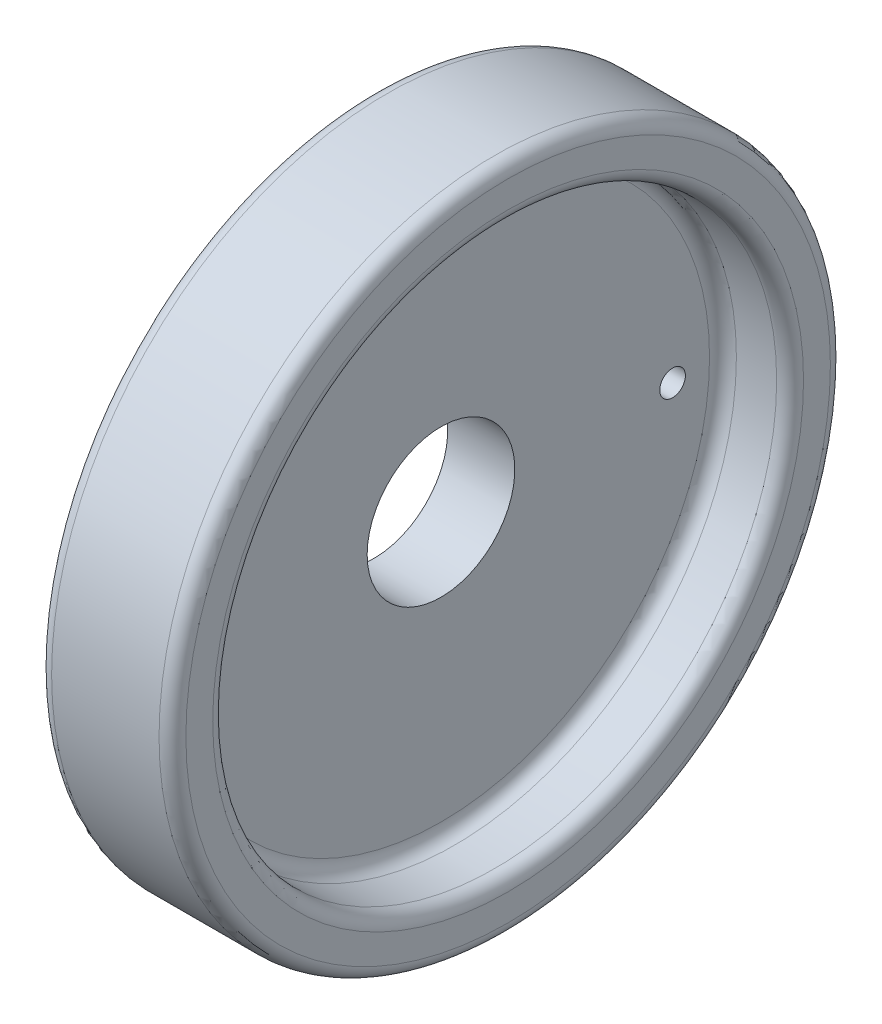
ISO-10303-21;
HEADER;
FILE_DESCRIPTION(('STEP AP214'),'2;1');
FILE_NAME('part.step','',(''),(''),'','','');
FILE_SCHEMA(('AUTOMOTIVE_DESIGN { 1 0 10303 214 1 1 1 1 }'));
ENDSEC;
DATA;
#1=APPLICATION_CONTEXT('core data for automotive mechanical design processes');
#2=APPLICATION_PROTOCOL_DEFINITION('international standard','automotive_design',2000,#1);
#3=PRODUCT_CONTEXT('',#1,'mechanical');
#4=PRODUCT('Part','Part','',(#3));
#5=PRODUCT_RELATED_PRODUCT_CATEGORY('part','',(#4));
#6=PRODUCT_DEFINITION_FORMATION('','',#4);
#7=PRODUCT_DEFINITION_CONTEXT('part definition',#1,'design');
#8=PRODUCT_DEFINITION('design','',#6,#7);
#9=PRODUCT_DEFINITION_SHAPE('','',#8);
#10=(LENGTH_UNIT() NAMED_UNIT(*) SI_UNIT(.MILLI.,.METRE.));
#11=(NAMED_UNIT(*) PLANE_ANGLE_UNIT() SI_UNIT($,.RADIAN.));
#12=(NAMED_UNIT(*) SI_UNIT($,.STERADIAN.) SOLID_ANGLE_UNIT());
#13=UNCERTAINTY_MEASURE_WITH_UNIT(LENGTH_MEASURE(1.E-05),#10,'distance_accuracy_value','');
#14=(GEOMETRIC_REPRESENTATION_CONTEXT(3) GLOBAL_UNCERTAINTY_ASSIGNED_CONTEXT((#13)) GLOBAL_UNIT_ASSIGNED_CONTEXT((#10,
#11,#12)) REPRESENTATION_CONTEXT('',''));
#15=CARTESIAN_POINT('',(0.,0.,0.));
#16=DIRECTION('',(0.,0.,1.));
#17=DIRECTION('',(1.,0.,0.));
#18=AXIS2_PLACEMENT_3D('',#15,#16,#17);
#19=CARTESIAN_POINT('',(0.,0.,0.));
#20=DIRECTION('',(-1.,0.,0.));
#21=DIRECTION('',(0.,0.,1.));
#22=AXIS2_PLACEMENT_3D('',#19,#20,#21);
#23=CYLINDRICAL_SURFACE('',#22,2.75);
#24=CARTESIAN_POINT('',(2.5,0.,0.));
#25=DIRECTION('',(-1.,0.,0.));
#26=DIRECTION('',(0.,0.,1.));
#27=AXIS2_PLACEMENT_3D('',#24,#25,#26);
#28=CIRCLE('',#27,2.75);
#29=CARTESIAN_POINT('',(2.5,0.,2.75));
#30=VERTEX_POINT('',#29);
#31=EDGE_CURVE('E10',#30,#30,#28,.T.);
#32=ORIENTED_EDGE('',*,*,#31,.F.);
#33=EDGE_LOOP('',(#32));
#34=FACE_BOUND('',#33,.T.);
#35=CARTESIAN_POINT('',(0.,0.,0.));
#36=DIRECTION('',(-1.,0.,0.));
#37=DIRECTION('',(0.,0.,1.));
#38=AXIS2_PLACEMENT_3D('',#35,#36,#37);
#39=CIRCLE('',#38,2.75);
#40=CARTESIAN_POINT('',(0.,0.,2.75));
#41=VERTEX_POINT('',#40);
#42=EDGE_CURVE('E66',#41,#41,#39,.T.);
#43=ORIENTED_EDGE('',*,*,#42,.T.);
#44=EDGE_LOOP('',(#43));
#45=FACE_BOUND('',#44,.T.);
#46=ADVANCED_FACE('F32',(#34,#45),#23,.F.);
#47=CARTESIAN_POINT('',(2.5,10.,0.));
#48=DIRECTION('',(-1.,0.,0.));
#49=DIRECTION('',(0.,0.,1.));
#50=AXIS2_PLACEMENT_3D('',#47,#48,#49);
#51=PLANE('',#50);
#52=CARTESIAN_POINT('',(2.5,-0.147893683854624,-8.62333941244589));
#53=DIRECTION('',(1.,0.,0.));
#54=DIRECTION('',(0.,0.,-1.));
#55=AXIS2_PLACEMENT_3D('',#52,#53,#54);
#56=CIRCLE('',#55,0.4778103632226);
#57=CARTESIAN_POINT('',(2.5,-0.147893683854624,-9.10114977566849));
#58=VERTEX_POINT('',#57);
#59=EDGE_CURVE('E72',#58,#58,#56,.T.);
#60=ORIENTED_EDGE('',*,*,#59,.F.);
#61=EDGE_LOOP('',(#60));
#62=FACE_BOUND('',#61,.T.);
#63=CARTESIAN_POINT('',(2.5,0.,0.));
#64=DIRECTION('',(-1.,0.,0.));
#65=DIRECTION('',(0.,0.,1.));
#66=AXIS2_PLACEMENT_3D('',#63,#64,#65);
#67=CIRCLE('',#66,10.);
#68=CARTESIAN_POINT('',(2.5,0.,10.));
#69=VERTEX_POINT('',#68);
#70=EDGE_CURVE('E38',#69,#69,#67,.T.);
#71=ORIENTED_EDGE('',*,*,#70,.F.);
#72=EDGE_LOOP('',(#71));
#73=FACE_BOUND('',#72,.T.);
#74=ORIENTED_EDGE('',*,*,#31,.T.);
#75=EDGE_LOOP('',(#74));
#76=FACE_BOUND('',#75,.T.);
#77=ADVANCED_FACE('F79',(#62,#73,#76),#51,.F.);
#78=CARTESIAN_POINT('',(3.,0.,0.));
#79=DIRECTION('',(-1.,0.,0.));
#80=DIRECTION('',(0.,0.,1.));
#81=AXIS2_PLACEMENT_3D('',#78,#79,#80);
#82=TOROIDAL_SURFACE('',#81,10.,0.500000000000001);
#83=CARTESIAN_POINT('',(3.,0.,0.));
#84=DIRECTION('',(-1.,0.,0.));
#85=DIRECTION('',(0.,0.,1.));
#86=AXIS2_PLACEMENT_3D('',#83,#84,#85);
#87=CIRCLE('',#86,10.5);
#88=CARTESIAN_POINT('',(3.,0.,10.5));
#89=VERTEX_POINT('',#88);
#90=EDGE_CURVE('E42',#89,#89,#87,.T.);
#91=ORIENTED_EDGE('',*,*,#90,.F.);
#92=EDGE_LOOP('',(#91));
#93=FACE_BOUND('',#92,.T.);
#94=ORIENTED_EDGE('',*,*,#70,.T.);
#95=EDGE_LOOP('',(#94));
#96=FACE_BOUND('',#95,.T.);
#97=ADVANCED_FACE('F82',(#93,#96),#82,.F.);
#98=CARTESIAN_POINT('',(0.,0.,0.));
#99=DIRECTION('',(-1.,0.,0.));
#100=DIRECTION('',(0.,0.,1.));
#101=AXIS2_PLACEMENT_3D('',#98,#99,#100);
#102=CYLINDRICAL_SURFACE('',#101,10.5);
#103=CARTESIAN_POINT('',(4.5,0.,0.));
#104=DIRECTION('',(-1.,0.,0.));
#105=DIRECTION('',(0.,0.,1.));
#106=AXIS2_PLACEMENT_3D('',#103,#104,#105);
#107=CIRCLE('',#106,10.5);
#108=CARTESIAN_POINT('',(4.5,0.,10.5));
#109=VERTEX_POINT('',#108);
#110=EDGE_CURVE('E46',#109,#109,#107,.T.);
#111=ORIENTED_EDGE('',*,*,#110,.F.);
#112=EDGE_LOOP('',(#111));
#113=FACE_BOUND('',#112,.T.);
#114=ORIENTED_EDGE('',*,*,#90,.T.);
#115=EDGE_LOOP('',(#114));
#116=FACE_BOUND('',#115,.T.);
#117=ADVANCED_FACE('F87',(#113,#116),#102,.F.);
#118=CARTESIAN_POINT('',(4.5,0.,0.));
#119=DIRECTION('',(-1.,0.,0.));
#120=DIRECTION('',(0.,0.,1.));
#121=AXIS2_PLACEMENT_3D('',#118,#119,#120);
#122=TOROIDAL_SURFACE('',#121,11.,0.500000000000001);
#123=CARTESIAN_POINT('',(5.,0.,0.));
#124=DIRECTION('',(-1.,0.,0.));
#125=DIRECTION('',(0.,0.,1.));
#126=AXIS2_PLACEMENT_3D('',#123,#124,#125);
#127=CIRCLE('',#126,11.);
#128=CARTESIAN_POINT('',(5.,0.,11.));
#129=VERTEX_POINT('',#128);
#130=EDGE_CURVE('E51',#129,#129,#127,.T.);
#131=ORIENTED_EDGE('',*,*,#130,.F.);
#132=EDGE_LOOP('',(#131));
#133=FACE_BOUND('',#132,.T.);
#134=ORIENTED_EDGE('',*,*,#110,.T.);
#135=EDGE_LOOP('',(#134));
#136=FACE_BOUND('',#135,.T.);
#137=ADVANCED_FACE('F94',(#133,#136),#122,.T.);
#138=CARTESIAN_POINT('',(5.,12.,0.));
#139=DIRECTION('',(-1.,0.,0.));
#140=DIRECTION('',(0.,0.,1.));
#141=AXIS2_PLACEMENT_3D('',#138,#139,#140);
#142=PLANE('',#141);
#143=CARTESIAN_POINT('',(5.,0.,0.));
#144=DIRECTION('',(-1.,0.,0.));
#145=DIRECTION('',(0.,0.,1.));
#146=AXIS2_PLACEMENT_3D('',#143,#144,#145);
#147=CIRCLE('',#146,12.);
#148=CARTESIAN_POINT('',(5.,0.,12.));
#149=VERTEX_POINT('',#148);
#150=EDGE_CURVE('E54',#149,#149,#147,.T.);
#151=ORIENTED_EDGE('',*,*,#150,.F.);
#152=EDGE_LOOP('',(#151));
#153=FACE_BOUND('',#152,.T.);
#154=ORIENTED_EDGE('',*,*,#130,.T.);
#155=EDGE_LOOP('',(#154));
#156=FACE_BOUND('',#155,.T.);
#157=ADVANCED_FACE('F98',(#153,#156),#142,.F.);
#158=CARTESIAN_POINT('',(4.5,0.,0.));
#159=DIRECTION('',(-1.,0.,0.));
#160=DIRECTION('',(0.,0.,1.));
#161=AXIS2_PLACEMENT_3D('',#158,#159,#160);
#162=TOROIDAL_SURFACE('',#161,12.,0.5);
#163=CARTESIAN_POINT('',(4.5,0.,0.));
#164=DIRECTION('',(-1.,0.,0.));
#165=DIRECTION('',(0.,0.,1.));
#166=AXIS2_PLACEMENT_3D('',#163,#164,#165);
#167=CIRCLE('',#166,12.5);
#168=CARTESIAN_POINT('',(4.5,0.,12.5));
#169=VERTEX_POINT('',#168);
#170=EDGE_CURVE('E57',#169,#169,#167,.T.);
#171=ORIENTED_EDGE('',*,*,#170,.F.);
#172=EDGE_LOOP('',(#171));
#173=FACE_BOUND('',#172,.T.);
#174=ORIENTED_EDGE('',*,*,#150,.T.);
#175=EDGE_LOOP('',(#174));
#176=FACE_BOUND('',#175,.T.);
#177=ADVANCED_FACE('F102',(#173,#176),#162,.T.);
#178=CARTESIAN_POINT('',(0.,0.,0.));
#179=DIRECTION('',(-1.,0.,0.));
#180=DIRECTION('',(0.,0.,1.));
#181=AXIS2_PLACEMENT_3D('',#178,#179,#180);
#182=CYLINDRICAL_SURFACE('',#181,12.5);
#183=CARTESIAN_POINT('',(0.5,0.,0.));
#184=DIRECTION('',(-1.,0.,0.));
#185=DIRECTION('',(0.,0.,1.));
#186=AXIS2_PLACEMENT_3D('',#183,#184,#185);
#187=CIRCLE('',#186,12.5);
#188=CARTESIAN_POINT('',(0.5,0.,12.5));
#189=VERTEX_POINT('',#188);
#190=EDGE_CURVE('E60',#189,#189,#187,.T.);
#191=ORIENTED_EDGE('',*,*,#190,.F.);
#192=EDGE_LOOP('',(#191));
#193=FACE_BOUND('',#192,.T.);
#194=ORIENTED_EDGE('',*,*,#170,.T.);
#195=EDGE_LOOP('',(#194));
#196=FACE_BOUND('',#195,.T.);
#197=ADVANCED_FACE('F106',(#193,#196),#182,.T.);
#198=CARTESIAN_POINT('',(0.5,0.,0.));
#199=DIRECTION('',(-1.,0.,0.));
#200=DIRECTION('',(0.,0.,1.));
#201=AXIS2_PLACEMENT_3D('',#198,#199,#200);
#202=TOROIDAL_SURFACE('',#201,12.,0.5);
#203=CARTESIAN_POINT('',(0.,0.,0.));
#204=DIRECTION('',(-1.,0.,0.));
#205=DIRECTION('',(0.,0.,1.));
#206=AXIS2_PLACEMENT_3D('',#203,#204,#205);
#207=CIRCLE('',#206,12.);
#208=CARTESIAN_POINT('',(0.,0.,12.));
#209=VERTEX_POINT('',#208);
#210=EDGE_CURVE('E63',#209,#209,#207,.T.);
#211=ORIENTED_EDGE('',*,*,#210,.F.);
#212=EDGE_LOOP('',(#211));
#213=FACE_BOUND('',#212,.T.);
#214=ORIENTED_EDGE('',*,*,#190,.T.);
#215=EDGE_LOOP('',(#214));
#216=FACE_BOUND('',#215,.T.);
#217=ADVANCED_FACE('F110',(#213,#216),#202,.T.);
#218=CARTESIAN_POINT('',(0.,2.75,0.));
#219=DIRECTION('',(1.,0.,0.));
#220=DIRECTION('',(0.,0.,-1.));
#221=AXIS2_PLACEMENT_3D('',#218,#219,#220);
#222=PLANE('',#221);
#223=CARTESIAN_POINT('',(0.,-0.147893683854624,-8.62333941244589));
#224=DIRECTION('',(1.,0.,0.));
#225=DIRECTION('',(0.,0.,-1.));
#226=AXIS2_PLACEMENT_3D('',#223,#224,#225);
#227=CIRCLE('',#226,0.4778103632226);
#228=CARTESIAN_POINT('',(0.,-0.147893683854624,-9.10114977566849));
#229=VERTEX_POINT('',#228);
#230=EDGE_CURVE('E69',#229,#229,#227,.F.);
#231=ORIENTED_EDGE('',*,*,#230,.F.);
#232=EDGE_LOOP('',(#231));
#233=FACE_BOUND('',#232,.T.);
#234=ORIENTED_EDGE('',*,*,#42,.F.);
#235=EDGE_LOOP('',(#234));
#236=FACE_BOUND('',#235,.T.);
#237=ORIENTED_EDGE('',*,*,#210,.T.);
#238=EDGE_LOOP('',(#237));
#239=FACE_BOUND('',#238,.T.);
#240=ADVANCED_FACE('F114',(#233,#236,#239),#222,.F.);
#241=CARTESIAN_POINT('',(-0.00100000000000013,-0.147893683854624,-8.62333941244589));
#242=DIRECTION('',(1.,0.,0.));
#243=DIRECTION('',(0.,0.,-1.));
#244=AXIS2_PLACEMENT_3D('',#241,#242,#243);
#245=CYLINDRICAL_SURFACE('',#244,0.4778103632226);
#246=ORIENTED_EDGE('',*,*,#59,.T.);
#247=EDGE_LOOP('',(#246));
#248=FACE_BOUND('',#247,.T.);
#249=ORIENTED_EDGE('',*,*,#230,.T.);
#250=EDGE_LOOP('',(#249));
#251=FACE_BOUND('',#250,.T.);
#252=ADVANCED_FACE('F76',(#248,#251),#245,.F.);
#253=CLOSED_SHELL('',(#46,#77,#97,#117,#137,#157,#177,#197,#217,#240,#252));
#254=MANIFOLD_SOLID_BREP('B2',#253);
#255=ADVANCED_BREP_SHAPE_REPRESENTATION('',(#18,#254),#14);
#256=SHAPE_DEFINITION_REPRESENTATION(#9,#255);
ENDSEC;
END-ISO-10303-21;
